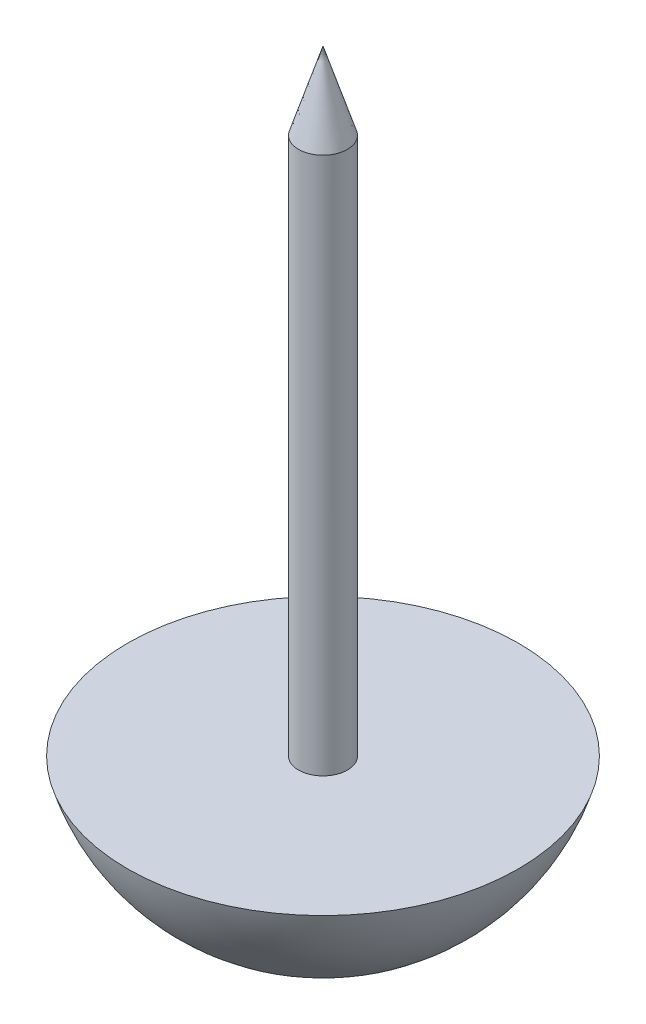
ISO-10303-21;
HEADER;
FILE_DESCRIPTION(('STEP AP214'),'2;1');
FILE_NAME('part.step','',(''),(''),'','','');
FILE_SCHEMA(('AUTOMOTIVE_DESIGN { 1 0 10303 214 1 1 1 1 }'));
ENDSEC;
DATA;
#1=APPLICATION_CONTEXT('core data for automotive mechanical design processes');
#2=APPLICATION_PROTOCOL_DEFINITION('international standard','automotive_design',2000,#1);
#3=PRODUCT_CONTEXT('',#1,'mechanical');
#4=PRODUCT('Part','Part','',(#3));
#5=PRODUCT_RELATED_PRODUCT_CATEGORY('part','',(#4));
#6=PRODUCT_DEFINITION_FORMATION('','',#4);
#7=PRODUCT_DEFINITION_CONTEXT('part definition',#1,'design');
#8=PRODUCT_DEFINITION('design','',#6,#7);
#9=PRODUCT_DEFINITION_SHAPE('','',#8);
#10=(LENGTH_UNIT() NAMED_UNIT(*) SI_UNIT(.MILLI.,.METRE.));
#11=(NAMED_UNIT(*) PLANE_ANGLE_UNIT() SI_UNIT($,.RADIAN.));
#12=(NAMED_UNIT(*) SI_UNIT($,.STERADIAN.) SOLID_ANGLE_UNIT());
#13=UNCERTAINTY_MEASURE_WITH_UNIT(LENGTH_MEASURE(1.E-05),#10,'distance_accuracy_value','');
#14=(GEOMETRIC_REPRESENTATION_CONTEXT(3) GLOBAL_UNCERTAINTY_ASSIGNED_CONTEXT((#13)) GLOBAL_UNIT_ASSIGNED_CONTEXT((#10,
#11,#12)) REPRESENTATION_CONTEXT('',''));
#15=CARTESIAN_POINT('',(0.,0.,0.));
#16=DIRECTION('',(0.,0.,1.));
#17=DIRECTION('',(1.,0.,0.));
#18=AXIS2_PLACEMENT_3D('',#15,#16,#17);
#19=CARTESIAN_POINT('',(0.,17.4625,0.));
#20=DIRECTION('',(0.,-1.,0.));
#21=DIRECTION('',(0.,0.,-1.));
#22=AXIS2_PLACEMENT_3D('',#19,#20,#21);
#23=CONICAL_SURFACE('',#22,0.793750000000003,0.306082477660716);
#24=CARTESIAN_POINT('',(0.,19.974260588641,0.));
#25=VERTEX_POINT('',#24);
#26=VERTEX_LOOP('',#25);
#27=FACE_BOUND('',#26,.T.);
#28=CARTESIAN_POINT('',(0.,17.4625,0.));
#29=DIRECTION('',(0.,1.,0.));
#30=DIRECTION('',(0.,0.,1.));
#31=AXIS2_PLACEMENT_3D('',#28,#29,#30);
#32=CIRCLE('',#31,0.793750000000003);
#33=CARTESIAN_POINT('',(0.,17.4625,0.793750000000003));
#34=VERTEX_POINT('',#33);
#35=EDGE_CURVE('E47',#34,#34,#32,.T.);
#36=ORIENTED_EDGE('',*,*,#35,.T.);
#37=EDGE_LOOP('',(#36));
#38=FACE_BOUND('',#37,.T.);
#39=ADVANCED_FACE('F33',(#27,#38),#23,.T.);
#40=CARTESIAN_POINT('',(0.,1.85208333333333,0.));
#41=DIRECTION('',(0.,1.,0.));
#42=DIRECTION('',(0.,0.,-1.));
#43=AXIS2_PLACEMENT_3D('',#40,#41,#42);
#44=SPHERICAL_SURFACE('',#43,6.61458333333333);
#45=CARTESIAN_POINT('',(0.,0.,0.));
#46=DIRECTION('',(0.,1.,0.));
#47=DIRECTION('',(0.,0.,1.));
#48=AXIS2_PLACEMENT_3D('',#45,#46,#47);
#49=CIRCLE('',#48,6.35);
#50=CARTESIAN_POINT('',(0.,0.,6.35));
#51=VERTEX_POINT('',#50);
#52=EDGE_CURVE('E11',#51,#51,#49,.T.);
#53=ORIENTED_EDGE('',*,*,#52,.F.);
#54=EDGE_LOOP('',(#53));
#55=FACE_BOUND('',#54,.T.);
#56=ADVANCED_FACE('F44',(#55),#44,.T.);
#57=CARTESIAN_POINT('',(0.,0.,-6.35));
#58=DIRECTION('',(0.,-1.,0.));
#59=DIRECTION('',(0.,0.,-1.));
#60=AXIS2_PLACEMENT_3D('',#57,#58,#59);
#61=PLANE('',#60);
#62=CARTESIAN_POINT('',(0.,0.,0.));
#63=DIRECTION('',(0.,1.,0.));
#64=DIRECTION('',(0.,0.,1.));
#65=AXIS2_PLACEMENT_3D('',#62,#63,#64);
#66=CIRCLE('',#65,0.793750000000003);
#67=CARTESIAN_POINT('',(0.,0.,0.793750000000003));
#68=VERTEX_POINT('',#67);
#69=EDGE_CURVE('E39',#68,#68,#66,.T.);
#70=ORIENTED_EDGE('',*,*,#69,.F.);
#71=EDGE_LOOP('',(#70));
#72=FACE_BOUND('',#71,.T.);
#73=ORIENTED_EDGE('',*,*,#52,.T.);
#74=EDGE_LOOP('',(#73));
#75=FACE_BOUND('',#74,.T.);
#76=ADVANCED_FACE('F55',(#72,#75),#61,.F.);
#77=CARTESIAN_POINT('',(0.,26.7947321428571,0.));
#78=DIRECTION('',(0.,1.,0.));
#79=DIRECTION('',(0.,0.,1.));
#80=AXIS2_PLACEMENT_3D('',#77,#78,#79);
#81=CYLINDRICAL_SURFACE('',#80,0.793750000000003);
#82=ORIENTED_EDGE('',*,*,#35,.F.);
#83=EDGE_LOOP('',(#82));
#84=FACE_BOUND('',#83,.T.);
#85=ORIENTED_EDGE('',*,*,#69,.T.);
#86=EDGE_LOOP('',(#85));
#87=FACE_BOUND('',#86,.T.);
#88=ADVANCED_FACE('F53',(#84,#87),#81,.T.);
#89=CLOSED_SHELL('',(#39,#56,#76,#88));
#90=MANIFOLD_SOLID_BREP('B2',#89);
#91=ADVANCED_BREP_SHAPE_REPRESENTATION('',(#18,#90),#14);
#92=SHAPE_DEFINITION_REPRESENTATION(#9,#91);
ENDSEC;
END-ISO-10303-21;
